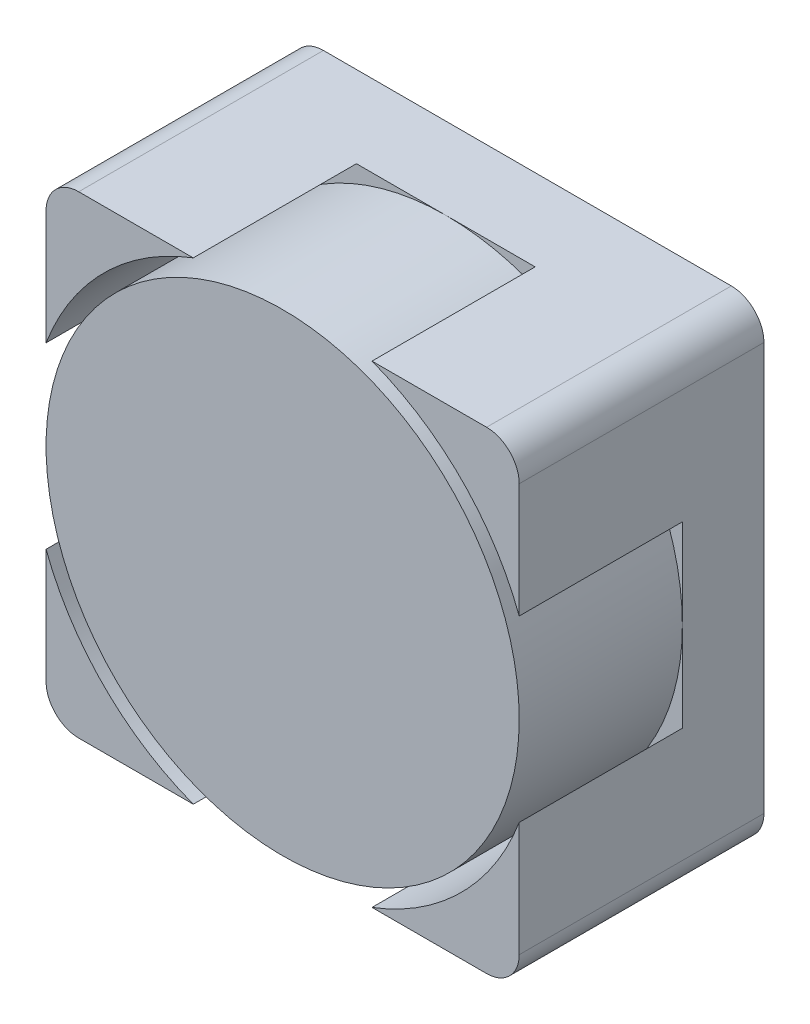
ISO-10303-21;
HEADER;
FILE_DESCRIPTION(('STEP AP214'),'2;1');
FILE_NAME('part.step','',(''),(''),'','','');
FILE_SCHEMA(('AUTOMOTIVE_DESIGN { 1 0 10303 214 1 1 1 1 }'));
ENDSEC;
DATA;
#1=APPLICATION_CONTEXT('core data for automotive mechanical design processes');
#2=APPLICATION_PROTOCOL_DEFINITION('international standard','automotive_design',2000,#1);
#3=PRODUCT_CONTEXT('',#1,'mechanical');
#4=PRODUCT('Part','Part','',(#3));
#5=PRODUCT_RELATED_PRODUCT_CATEGORY('part','',(#4));
#6=PRODUCT_DEFINITION_FORMATION('','',#4);
#7=PRODUCT_DEFINITION_CONTEXT('part definition',#1,'design');
#8=PRODUCT_DEFINITION('design','',#6,#7);
#9=PRODUCT_DEFINITION_SHAPE('','',#8);
#10=(LENGTH_UNIT() NAMED_UNIT(*) SI_UNIT(.MILLI.,.METRE.));
#11=(NAMED_UNIT(*) PLANE_ANGLE_UNIT() SI_UNIT($,.RADIAN.));
#12=(NAMED_UNIT(*) SI_UNIT($,.STERADIAN.) SOLID_ANGLE_UNIT());
#13=UNCERTAINTY_MEASURE_WITH_UNIT(LENGTH_MEASURE(1.E-05),#10,'distance_accuracy_value','');
#14=(GEOMETRIC_REPRESENTATION_CONTEXT(3) GLOBAL_UNCERTAINTY_ASSIGNED_CONTEXT((#13)) GLOBAL_UNIT_ASSIGNED_CONTEXT((#10,
#11,#12)) REPRESENTATION_CONTEXT('',''));
#15=CARTESIAN_POINT('',(0.,0.,0.));
#16=DIRECTION('',(0.,0.,1.));
#17=DIRECTION('',(1.,0.,0.));
#18=AXIS2_PLACEMENT_3D('',#15,#16,#17);
#19=CARTESIAN_POINT('',(0.,0.,3.));
#20=DIRECTION('',(0.,0.,1.));
#21=DIRECTION('',(1.,0.,0.));
#22=AXIS2_PLACEMENT_3D('',#19,#20,#21);
#23=PLANE('',#22);
#24=CARTESIAN_POINT('',(0.,0.,3.));
#25=DIRECTION('',(0.,0.,1.));
#26=DIRECTION('',(1.,0.,0.));
#27=AXIS2_PLACEMENT_3D('',#24,#25,#26);
#28=CIRCLE('',#27,2.9);
#29=CARTESIAN_POINT('',(2.9,0.,3.));
#30=VERTEX_POINT('',#29);
#31=EDGE_CURVE('E20',#30,#30,#28,.F.);
#32=ORIENTED_EDGE('',*,*,#31,.F.);
#33=EDGE_LOOP('',(#32));
#34=FACE_BOUND('',#33,.T.);
#35=ADVANCED_FACE('F17',(#34),#23,.T.);
#36=CARTESIAN_POINT('',(0.,0.,-8.76812408671319));
#37=DIRECTION('',(0.,0.,1.));
#38=DIRECTION('',(1.,0.,0.));
#39=AXIS2_PLACEMENT_3D('',#36,#37,#38);
#40=CYLINDRICAL_SURFACE('',#39,2.9);
#41=ORIENTED_EDGE('',*,*,#31,.T.);
#42=EDGE_LOOP('',(#41));
#43=FACE_BOUND('',#42,.T.);
#44=CARTESIAN_POINT('',(0.,0.,0.999999999999999));
#45=DIRECTION('',(0.,0.,1.));
#46=DIRECTION('',(1.,0.,0.));
#47=AXIS2_PLACEMENT_3D('',#44,#45,#46);
#48=CIRCLE('',#47,2.9);
#49=CARTESIAN_POINT('',(-2.9,0.,1.));
#50=VERTEX_POINT('',#49);
#51=CARTESIAN_POINT('',(0.,2.9,1.));
#52=VERTEX_POINT('',#51);
#53=EDGE_CURVE('E141',#50,#52,#48,.F.);
#54=ORIENTED_EDGE('',*,*,#53,.F.);
#55=CARTESIAN_POINT('',(0.,0.,0.999999999999999));
#56=DIRECTION('',(0.,0.,1.));
#57=DIRECTION('',(1.,0.,0.));
#58=AXIS2_PLACEMENT_3D('',#55,#56,#57);
#59=CIRCLE('',#58,2.9);
#60=CARTESIAN_POINT('',(0.,-2.9,1.));
#61=VERTEX_POINT('',#60);
#62=EDGE_CURVE('E137',#61,#50,#59,.F.);
#63=ORIENTED_EDGE('',*,*,#62,.F.);
#64=CARTESIAN_POINT('',(0.,0.,0.999999999999999));
#65=DIRECTION('',(0.,0.,1.));
#66=DIRECTION('',(1.,0.,0.));
#67=AXIS2_PLACEMENT_3D('',#64,#65,#66);
#68=CIRCLE('',#67,2.9);
#69=CARTESIAN_POINT('',(2.9,0.,1.));
#70=VERTEX_POINT('',#69);
#71=EDGE_CURVE('E128',#70,#61,#68,.F.);
#72=ORIENTED_EDGE('',*,*,#71,.F.);
#73=CARTESIAN_POINT('',(0.,0.,0.999999999999999));
#74=DIRECTION('',(0.,0.,1.));
#75=DIRECTION('',(1.,0.,0.));
#76=AXIS2_PLACEMENT_3D('',#73,#74,#75);
#77=CIRCLE('',#76,2.9);
#78=EDGE_CURVE('E224',#52,#70,#77,.F.);
#79=ORIENTED_EDGE('',*,*,#78,.F.);
#80=EDGE_LOOP('',(#54,#63,#72,#79));
#81=FACE_BOUND('',#80,.T.);
#82=ADVANCED_FACE('F139',(#43,#81),#40,.T.);
#83=CARTESIAN_POINT('',(0.,0.,3.));
#84=DIRECTION('',(0.,0.,1.));
#85=DIRECTION('',(1.,0.,0.));
#86=AXIS2_PLACEMENT_3D('',#83,#84,#85);
#87=PLANE('',#86);
#88=CARTESIAN_POINT('',(0.,0.,3.));
#89=DIRECTION('',(0.,0.,1.));
#90=DIRECTION('',(1.,0.,0.));
#91=AXIS2_PLACEMENT_3D('',#88,#89,#90);
#92=CIRCLE('',#91,3.1);
#93=CARTESIAN_POINT('',(2.9,-1.09544511501034,3.));
#94=VERTEX_POINT('',#93);
#95=CARTESIAN_POINT('',(1.09544511501033,-2.9,3.));
#96=VERTEX_POINT('',#95);
#97=EDGE_CURVE('E208',#94,#96,#92,.F.);
#98=ORIENTED_EDGE('',*,*,#97,.T.);
#99=DIRECTION('',(1.,0.,0.));
#100=VECTOR('',#99,1.);
#101=CARTESIAN_POINT('',(0.,-2.9,3.));
#102=LINE('',#101,#100);
#103=CARTESIAN_POINT('',(2.5,-2.9,3.));
#104=VERTEX_POINT('',#103);
#105=EDGE_CURVE('E168',#96,#104,#102,.T.);
#106=ORIENTED_EDGE('',*,*,#105,.T.);
#107=CARTESIAN_POINT('',(2.5,-2.5,3.));
#108=DIRECTION('',(0.,0.,-1.));
#109=DIRECTION('',(-1.,0.,0.));
#110=AXIS2_PLACEMENT_3D('',#107,#108,#109);
#111=CIRCLE('',#110,0.4);
#112=CARTESIAN_POINT('',(2.9,-2.5,3.));
#113=VERTEX_POINT('',#112);
#114=EDGE_CURVE('E211',#113,#104,#111,.T.);
#115=ORIENTED_EDGE('',*,*,#114,.F.);
#116=DIRECTION('',(0.,1.,0.));
#117=VECTOR('',#116,1.);
#118=CARTESIAN_POINT('',(2.9,0.,3.));
#119=LINE('',#118,#117);
#120=EDGE_CURVE('E178',#113,#94,#119,.T.);
#121=ORIENTED_EDGE('',*,*,#120,.T.);
#122=EDGE_LOOP('',(#98,#106,#115,#121));
#123=FACE_BOUND('',#122,.T.);
#124=ADVANCED_FACE('F339',(#123),#87,.T.);
#125=CARTESIAN_POINT('',(0.,0.,1.));
#126=DIRECTION('',(0.,0.,1.));
#127=DIRECTION('',(1.,0.,0.));
#128=AXIS2_PLACEMENT_3D('',#125,#126,#127);
#129=PLANE('',#128);
#130=DIRECTION('',(1.,0.,0.));
#131=VECTOR('',#130,1.);
#132=CARTESIAN_POINT('',(0.,-2.9,1.));
#133=LINE('',#132,#131);
#134=CARTESIAN_POINT('',(1.09544511501033,-2.9,1.));
#135=VERTEX_POINT('',#134);
#136=EDGE_CURVE('E132',#61,#135,#133,.T.);
#137=ORIENTED_EDGE('',*,*,#136,.T.);
#138=CARTESIAN_POINT('',(0.,0.,0.999999999999999));
#139=DIRECTION('',(0.,0.,1.));
#140=DIRECTION('',(1.,0.,0.));
#141=AXIS2_PLACEMENT_3D('',#138,#139,#140);
#142=CIRCLE('',#141,3.1);
#143=CARTESIAN_POINT('',(2.9,-1.09544511501033,1.));
#144=VERTEX_POINT('',#143);
#145=EDGE_CURVE('E206',#135,#144,#142,.T.);
#146=ORIENTED_EDGE('',*,*,#145,.T.);
#147=DIRECTION('',(0.,1.,0.));
#148=VECTOR('',#147,1.);
#149=CARTESIAN_POINT('',(2.9,0.,1.));
#150=LINE('',#149,#148);
#151=EDGE_CURVE('E125',#144,#70,#150,.T.);
#152=ORIENTED_EDGE('',*,*,#151,.T.);
#153=ORIENTED_EDGE('',*,*,#71,.T.);
#154=EDGE_LOOP('',(#137,#146,#152,#153));
#155=FACE_BOUND('',#154,.T.);
#156=ADVANCED_FACE('F130',(#155),#129,.T.);
#157=CARTESIAN_POINT('',(0.,0.,3.));
#158=DIRECTION('',(0.,0.,1.));
#159=DIRECTION('',(1.,0.,0.));
#160=AXIS2_PLACEMENT_3D('',#157,#158,#159);
#161=PLANE('',#160);
#162=CARTESIAN_POINT('',(0.,0.,3.));
#163=DIRECTION('',(0.,0.,1.));
#164=DIRECTION('',(1.,0.,0.));
#165=AXIS2_PLACEMENT_3D('',#162,#163,#164);
#166=CIRCLE('',#165,3.1);
#167=CARTESIAN_POINT('',(1.09544511501033,2.9,3.));
#168=VERTEX_POINT('',#167);
#169=CARTESIAN_POINT('',(2.9,1.09544511501033,3.));
#170=VERTEX_POINT('',#169);
#171=EDGE_CURVE('E198',#168,#170,#166,.F.);
#172=ORIENTED_EDGE('',*,*,#171,.T.);
#173=DIRECTION('',(0.,1.,0.));
#174=VECTOR('',#173,1.);
#175=CARTESIAN_POINT('',(2.9,0.,3.));
#176=LINE('',#175,#174);
#177=CARTESIAN_POINT('',(2.9,2.5,3.));
#178=VERTEX_POINT('',#177);
#179=EDGE_CURVE('E163',#170,#178,#176,.T.);
#180=ORIENTED_EDGE('',*,*,#179,.T.);
#181=CARTESIAN_POINT('',(2.5,2.5,3.));
#182=DIRECTION('',(0.,0.,-1.));
#183=DIRECTION('',(-1.,0.,0.));
#184=AXIS2_PLACEMENT_3D('',#181,#182,#183);
#185=CIRCLE('',#184,0.4);
#186=CARTESIAN_POINT('',(2.5,2.9,3.));
#187=VERTEX_POINT('',#186);
#188=EDGE_CURVE('E201',#187,#178,#185,.T.);
#189=ORIENTED_EDGE('',*,*,#188,.F.);
#190=DIRECTION('',(1.,0.,0.));
#191=VECTOR('',#190,1.);
#192=CARTESIAN_POINT('',(0.,2.9,3.));
#193=LINE('',#192,#191);
#194=EDGE_CURVE('E161',#187,#168,#193,.F.);
#195=ORIENTED_EDGE('',*,*,#194,.T.);
#196=EDGE_LOOP('',(#172,#180,#189,#195));
#197=FACE_BOUND('',#196,.T.);
#198=ADVANCED_FACE('F326',(#197),#161,.T.);
#199=CARTESIAN_POINT('',(0.,0.,1.));
#200=DIRECTION('',(0.,0.,1.));
#201=DIRECTION('',(1.,0.,0.));
#202=AXIS2_PLACEMENT_3D('',#199,#200,#201);
#203=PLANE('',#202);
#204=DIRECTION('',(0.,1.,0.));
#205=VECTOR('',#204,1.);
#206=CARTESIAN_POINT('',(2.9,0.,1.));
#207=LINE('',#206,#205);
#208=CARTESIAN_POINT('',(2.9,1.09544511501033,1.));
#209=VERTEX_POINT('',#208);
#210=EDGE_CURVE('E223',#70,#209,#207,.T.);
#211=ORIENTED_EDGE('',*,*,#210,.T.);
#212=CARTESIAN_POINT('',(0.,0.,0.999999999999999));
#213=DIRECTION('',(0.,0.,1.));
#214=DIRECTION('',(1.,0.,0.));
#215=AXIS2_PLACEMENT_3D('',#212,#213,#214);
#216=CIRCLE('',#215,3.1);
#217=CARTESIAN_POINT('',(1.09544511501033,2.9,1.));
#218=VERTEX_POINT('',#217);
#219=EDGE_CURVE('E195',#209,#218,#216,.T.);
#220=ORIENTED_EDGE('',*,*,#219,.T.);
#221=DIRECTION('',(1.,0.,0.));
#222=VECTOR('',#221,1.);
#223=CARTESIAN_POINT('',(0.,2.9,1.));
#224=LINE('',#223,#222);
#225=EDGE_CURVE('E226',#218,#52,#224,.F.);
#226=ORIENTED_EDGE('',*,*,#225,.T.);
#227=ORIENTED_EDGE('',*,*,#78,.T.);
#228=EDGE_LOOP('',(#211,#220,#226,#227));
#229=FACE_BOUND('',#228,.T.);
#230=ADVANCED_FACE('F342',(#229),#203,.T.);
#231=CARTESIAN_POINT('',(0.,0.,3.));
#232=DIRECTION('',(0.,0.,1.));
#233=DIRECTION('',(1.,0.,0.));
#234=AXIS2_PLACEMENT_3D('',#231,#232,#233);
#235=PLANE('',#234);
#236=CARTESIAN_POINT('',(0.,0.,3.));
#237=DIRECTION('',(0.,0.,1.));
#238=DIRECTION('',(1.,0.,0.));
#239=AXIS2_PLACEMENT_3D('',#236,#237,#238);
#240=CIRCLE('',#239,3.1);
#241=CARTESIAN_POINT('',(-1.09544511501033,-2.9,3.));
#242=VERTEX_POINT('',#241);
#243=CARTESIAN_POINT('',(-2.9,-1.09544511501033,3.));
#244=VERTEX_POINT('',#243);
#245=EDGE_CURVE('E192',#242,#244,#240,.F.);
#246=ORIENTED_EDGE('',*,*,#245,.T.);
#247=DIRECTION('',(0.,1.,0.));
#248=VECTOR('',#247,1.);
#249=CARTESIAN_POINT('',(-2.9,0.,3.));
#250=LINE('',#249,#248);
#251=CARTESIAN_POINT('',(-2.9,-2.5,3.));
#252=VERTEX_POINT('',#251);
#253=EDGE_CURVE('E154',#244,#252,#250,.F.);
#254=ORIENTED_EDGE('',*,*,#253,.T.);
#255=CARTESIAN_POINT('',(-2.5,-2.5,3.));
#256=DIRECTION('',(0.,0.,-1.));
#257=DIRECTION('',(-1.,0.,0.));
#258=AXIS2_PLACEMENT_3D('',#255,#256,#257);
#259=CIRCLE('',#258,0.4);
#260=CARTESIAN_POINT('',(-2.5,-2.9,3.));
#261=VERTEX_POINT('',#260);
#262=EDGE_CURVE('E220',#252,#261,#259,.F.);
#263=ORIENTED_EDGE('',*,*,#262,.T.);
#264=DIRECTION('',(1.,0.,0.));
#265=VECTOR('',#264,1.);
#266=CARTESIAN_POINT('',(0.,-2.9,3.));
#267=LINE('',#266,#265);
#268=EDGE_CURVE('E222',#261,#242,#267,.T.);
#269=ORIENTED_EDGE('',*,*,#268,.T.);
#270=EDGE_LOOP('',(#246,#254,#263,#269));
#271=FACE_BOUND('',#270,.T.);
#272=ADVANCED_FACE('F287',(#271),#235,.T.);
#273=CARTESIAN_POINT('',(0.,0.,1.));
#274=DIRECTION('',(0.,0.,1.));
#275=DIRECTION('',(1.,0.,0.));
#276=AXIS2_PLACEMENT_3D('',#273,#274,#275);
#277=PLANE('',#276);
#278=DIRECTION('',(0.,1.,0.));
#279=VECTOR('',#278,1.);
#280=CARTESIAN_POINT('',(-2.9,0.,1.));
#281=LINE('',#280,#279);
#282=CARTESIAN_POINT('',(-2.9,-1.09544511501033,1.));
#283=VERTEX_POINT('',#282);
#284=EDGE_CURVE('E144',#50,#283,#281,.F.);
#285=ORIENTED_EDGE('',*,*,#284,.T.);
#286=CARTESIAN_POINT('',(0.,0.,0.999999999999999));
#287=DIRECTION('',(0.,0.,1.));
#288=DIRECTION('',(1.,0.,0.));
#289=AXIS2_PLACEMENT_3D('',#286,#287,#288);
#290=CIRCLE('',#289,3.1);
#291=CARTESIAN_POINT('',(-1.09544511501033,-2.9,1.));
#292=VERTEX_POINT('',#291);
#293=EDGE_CURVE('E150',#283,#292,#290,.T.);
#294=ORIENTED_EDGE('',*,*,#293,.T.);
#295=DIRECTION('',(1.,0.,0.));
#296=VECTOR('',#295,1.);
#297=CARTESIAN_POINT('',(0.,-2.9,1.));
#298=LINE('',#297,#296);
#299=EDGE_CURVE('E145',#292,#61,#298,.T.);
#300=ORIENTED_EDGE('',*,*,#299,.T.);
#301=ORIENTED_EDGE('',*,*,#62,.T.);
#302=EDGE_LOOP('',(#285,#294,#300,#301));
#303=FACE_BOUND('',#302,.T.);
#304=ADVANCED_FACE('F148',(#303),#277,.T.);
#305=CARTESIAN_POINT('',(0.,0.,1.));
#306=DIRECTION('',(0.,0.,1.));
#307=DIRECTION('',(1.,0.,0.));
#308=AXIS2_PLACEMENT_3D('',#305,#306,#307);
#309=PLANE('',#308);
#310=DIRECTION('',(0.,1.,0.));
#311=VECTOR('',#310,1.);
#312=CARTESIAN_POINT('',(-2.9,0.,1.));
#313=LINE('',#312,#311);
#314=CARTESIAN_POINT('',(-2.9,1.09544511501033,1.));
#315=VERTEX_POINT('',#314);
#316=EDGE_CURVE('E218',#315,#50,#313,.F.);
#317=ORIENTED_EDGE('',*,*,#316,.T.);
#318=ORIENTED_EDGE('',*,*,#53,.T.);
#319=DIRECTION('',(1.,0.,0.));
#320=VECTOR('',#319,1.);
#321=CARTESIAN_POINT('',(0.,2.9,1.));
#322=LINE('',#321,#320);
#323=CARTESIAN_POINT('',(-1.09544511501033,2.9,1.));
#324=VERTEX_POINT('',#323);
#325=EDGE_CURVE('E280',#52,#324,#322,.F.);
#326=ORIENTED_EDGE('',*,*,#325,.T.);
#327=CARTESIAN_POINT('',(0.,0.,0.999999999999999));
#328=DIRECTION('',(0.,0.,1.));
#329=DIRECTION('',(1.,0.,0.));
#330=AXIS2_PLACEMENT_3D('',#327,#328,#329);
#331=CIRCLE('',#330,3.1);
#332=EDGE_CURVE('E182',#324,#315,#331,.T.);
#333=ORIENTED_EDGE('',*,*,#332,.T.);
#334=EDGE_LOOP('',(#317,#318,#326,#333));
#335=FACE_BOUND('',#334,.T.);
#336=ADVANCED_FACE('F462',(#335),#309,.T.);
#337=CARTESIAN_POINT('',(0.,0.,3.));
#338=DIRECTION('',(0.,0.,1.));
#339=DIRECTION('',(1.,0.,0.));
#340=AXIS2_PLACEMENT_3D('',#337,#338,#339);
#341=PLANE('',#340);
#342=CARTESIAN_POINT('',(0.,0.,3.));
#343=DIRECTION('',(0.,0.,1.));
#344=DIRECTION('',(1.,0.,0.));
#345=AXIS2_PLACEMENT_3D('',#342,#343,#344);
#346=CIRCLE('',#345,3.1);
#347=CARTESIAN_POINT('',(-2.9,1.09544511501033,3.));
#348=VERTEX_POINT('',#347);
#349=CARTESIAN_POINT('',(-1.09544511501033,2.9,3.));
#350=VERTEX_POINT('',#349);
#351=EDGE_CURVE('E171',#348,#350,#346,.F.);
#352=ORIENTED_EDGE('',*,*,#351,.T.);
#353=DIRECTION('',(1.,0.,0.));
#354=VECTOR('',#353,1.);
#355=CARTESIAN_POINT('',(0.,2.9,3.));
#356=LINE('',#355,#354);
#357=CARTESIAN_POINT('',(-2.5,2.9,3.));
#358=VERTEX_POINT('',#357);
#359=EDGE_CURVE('E216',#350,#358,#356,.F.);
#360=ORIENTED_EDGE('',*,*,#359,.T.);
#361=CARTESIAN_POINT('',(-2.5,2.5,3.));
#362=DIRECTION('',(0.,0.,-1.));
#363=DIRECTION('',(-1.,0.,0.));
#364=AXIS2_PLACEMENT_3D('',#361,#362,#363);
#365=CIRCLE('',#364,0.4);
#366=CARTESIAN_POINT('',(-2.9,2.5,3.));
#367=VERTEX_POINT('',#366);
#368=EDGE_CURVE('E185',#367,#358,#365,.T.);
#369=ORIENTED_EDGE('',*,*,#368,.F.);
#370=DIRECTION('',(0.,1.,0.));
#371=VECTOR('',#370,1.);
#372=CARTESIAN_POINT('',(-2.9,0.,3.));
#373=LINE('',#372,#371);
#374=EDGE_CURVE('E217',#367,#348,#373,.F.);
#375=ORIENTED_EDGE('',*,*,#374,.T.);
#376=EDGE_LOOP('',(#352,#360,#369,#375));
#377=FACE_BOUND('',#376,.T.);
#378=ADVANCED_FACE('F454',(#377),#341,.T.);
#379=CARTESIAN_POINT('',(2.5,-2.5,3.));
#380=DIRECTION('',(0.,0.,-1.));
#381=DIRECTION('',(-1.,0.,0.));
#382=AXIS2_PLACEMENT_3D('',#379,#380,#381);
#383=CYLINDRICAL_SURFACE('',#382,0.4);
#384=ORIENTED_EDGE('',*,*,#114,.T.);
#385=DIRECTION('',(0.,0.,1.));
#386=VECTOR('',#385,1.);
#387=CARTESIAN_POINT('',(2.5,-2.9,3.));
#388=LINE('',#387,#386);
#389=CARTESIAN_POINT('',(2.5,-2.9,0.));
#390=VERTEX_POINT('',#389);
#391=EDGE_CURVE('E170',#104,#390,#388,.F.);
#392=ORIENTED_EDGE('',*,*,#391,.T.);
#393=CARTESIAN_POINT('',(2.5,-2.5,0.));
#394=DIRECTION('',(0.,0.,-1.));
#395=DIRECTION('',(-1.,0.,0.));
#396=AXIS2_PLACEMENT_3D('',#393,#394,#395);
#397=CIRCLE('',#396,0.4);
#398=CARTESIAN_POINT('',(2.9,-2.5,0.));
#399=VERTEX_POINT('',#398);
#400=EDGE_CURVE('E214',#390,#399,#397,.F.);
#401=ORIENTED_EDGE('',*,*,#400,.T.);
#402=DIRECTION('',(0.,0.,1.));
#403=VECTOR('',#402,1.);
#404=CARTESIAN_POINT('',(2.9,-2.5,3.));
#405=LINE('',#404,#403);
#406=EDGE_CURVE('E176',#399,#113,#405,.T.);
#407=ORIENTED_EDGE('',*,*,#406,.T.);
#408=EDGE_LOOP('',(#384,#392,#401,#407));
#409=FACE_BOUND('',#408,.T.);
#410=ADVANCED_FACE('F336',(#409),#383,.T.);
#411=CARTESIAN_POINT('',(0.,0.,-8.76812408671319));
#412=DIRECTION('',(0.,0.,1.));
#413=DIRECTION('',(1.,0.,0.));
#414=AXIS2_PLACEMENT_3D('',#411,#412,#413);
#415=CYLINDRICAL_SURFACE('',#414,3.1);
#416=ORIENTED_EDGE('',*,*,#145,.F.);
#417=DIRECTION('',(0.,0.,1.));
#418=VECTOR('',#417,1.);
#419=CARTESIAN_POINT('',(1.09544511501033,-2.9,3.));
#420=LINE('',#419,#418);
#421=EDGE_CURVE('E160',#135,#96,#420,.T.);
#422=ORIENTED_EDGE('',*,*,#421,.T.);
#423=ORIENTED_EDGE('',*,*,#97,.F.);
#424=DIRECTION('',(0.,0.,1.));
#425=VECTOR('',#424,1.);
#426=CARTESIAN_POINT('',(2.9,-1.09544511501033,3.));
#427=LINE('',#426,#425);
#428=EDGE_CURVE('E172',#94,#144,#427,.F.);
#429=ORIENTED_EDGE('',*,*,#428,.T.);
#430=EDGE_LOOP('',(#416,#422,#423,#429));
#431=FACE_BOUND('',#430,.T.);
#432=ADVANCED_FACE('F341',(#431),#415,.F.);
#433=CARTESIAN_POINT('',(2.5,2.5,3.));
#434=DIRECTION('',(0.,0.,-1.));
#435=DIRECTION('',(-1.,0.,0.));
#436=AXIS2_PLACEMENT_3D('',#433,#434,#435);
#437=CYLINDRICAL_SURFACE('',#436,0.4);
#438=ORIENTED_EDGE('',*,*,#188,.T.);
#439=DIRECTION('',(0.,0.,1.));
#440=VECTOR('',#439,1.);
#441=CARTESIAN_POINT('',(2.9,2.5,3.));
#442=LINE('',#441,#440);
#443=CARTESIAN_POINT('',(2.9,2.5,0.));
#444=VERTEX_POINT('',#443);
#445=EDGE_CURVE('E236',#178,#444,#442,.F.);
#446=ORIENTED_EDGE('',*,*,#445,.T.);
#447=CARTESIAN_POINT('',(2.5,2.5,0.));
#448=DIRECTION('',(0.,0.,-1.));
#449=DIRECTION('',(-1.,0.,0.));
#450=AXIS2_PLACEMENT_3D('',#447,#448,#449);
#451=CIRCLE('',#450,0.4);
#452=CARTESIAN_POINT('',(2.5,2.9,0.));
#453=VERTEX_POINT('',#452);
#454=EDGE_CURVE('E204',#444,#453,#451,.F.);
#455=ORIENTED_EDGE('',*,*,#454,.T.);
#456=DIRECTION('',(0.,0.,-1.));
#457=VECTOR('',#456,1.);
#458=CARTESIAN_POINT('',(2.5,2.9,3.));
#459=LINE('',#458,#457);
#460=EDGE_CURVE('E241',#453,#187,#459,.F.);
#461=ORIENTED_EDGE('',*,*,#460,.T.);
#462=EDGE_LOOP('',(#438,#446,#455,#461));
#463=FACE_BOUND('',#462,.T.);
#464=ADVANCED_FACE('F328',(#463),#437,.T.);
#465=CARTESIAN_POINT('',(0.,0.,-8.76812408671319));
#466=DIRECTION('',(0.,0.,1.));
#467=DIRECTION('',(1.,0.,0.));
#468=AXIS2_PLACEMENT_3D('',#465,#466,#467);
#469=CYLINDRICAL_SURFACE('',#468,3.1);
#470=ORIENTED_EDGE('',*,*,#219,.F.);
#471=DIRECTION('',(0.,0.,1.));
#472=VECTOR('',#471,1.);
#473=CARTESIAN_POINT('',(2.9,1.09544511501033,3.));
#474=LINE('',#473,#472);
#475=EDGE_CURVE('E233',#209,#170,#474,.T.);
#476=ORIENTED_EDGE('',*,*,#475,.T.);
#477=ORIENTED_EDGE('',*,*,#171,.F.);
#478=DIRECTION('',(0.,0.,-1.));
#479=VECTOR('',#478,1.);
#480=CARTESIAN_POINT('',(1.09544511501033,2.9,3.));
#481=LINE('',#480,#479);
#482=EDGE_CURVE('E238',#168,#218,#481,.T.);
#483=ORIENTED_EDGE('',*,*,#482,.T.);
#484=EDGE_LOOP('',(#470,#476,#477,#483));
#485=FACE_BOUND('',#484,.T.);
#486=ADVANCED_FACE('F343',(#485),#469,.F.);
#487=CARTESIAN_POINT('',(0.,0.,-8.76812408671319));
#488=DIRECTION('',(0.,0.,1.));
#489=DIRECTION('',(1.,0.,0.));
#490=AXIS2_PLACEMENT_3D('',#487,#488,#489);
#491=CYLINDRICAL_SURFACE('',#490,3.1);
#492=ORIENTED_EDGE('',*,*,#293,.F.);
#493=DIRECTION('',(0.,0.,1.));
#494=VECTOR('',#493,1.);
#495=CARTESIAN_POINT('',(-2.9,-1.09544511501033,3.));
#496=LINE('',#495,#494);
#497=EDGE_CURVE('E240',#283,#244,#496,.T.);
#498=ORIENTED_EDGE('',*,*,#497,.T.);
#499=ORIENTED_EDGE('',*,*,#245,.F.);
#500=DIRECTION('',(0.,0.,1.));
#501=VECTOR('',#500,1.);
#502=CARTESIAN_POINT('',(-1.09544511501033,-2.9,3.));
#503=LINE('',#502,#501);
#504=EDGE_CURVE('E237',#242,#292,#503,.F.);
#505=ORIENTED_EDGE('',*,*,#504,.T.);
#506=EDGE_LOOP('',(#492,#498,#499,#505));
#507=FACE_BOUND('',#506,.T.);
#508=ADVANCED_FACE('F291',(#507),#491,.F.);
#509=CARTESIAN_POINT('',(-2.5,-2.5,3.));
#510=DIRECTION('',(0.,0.,-1.));
#511=DIRECTION('',(-1.,0.,0.));
#512=AXIS2_PLACEMENT_3D('',#509,#510,#511);
#513=CYLINDRICAL_SURFACE('',#512,0.4);
#514=ORIENTED_EDGE('',*,*,#262,.F.);
#515=DIRECTION('',(0.,0.,1.));
#516=VECTOR('',#515,1.);
#517=CARTESIAN_POINT('',(-2.9,-2.5,3.));
#518=LINE('',#517,#516);
#519=CARTESIAN_POINT('',(-2.9,-2.5,0.));
#520=VERTEX_POINT('',#519);
#521=EDGE_CURVE('E247',#252,#520,#518,.F.);
#522=ORIENTED_EDGE('',*,*,#521,.T.);
#523=CARTESIAN_POINT('',(-2.5,-2.5,0.));
#524=DIRECTION('',(0.,0.,-1.));
#525=DIRECTION('',(-1.,0.,0.));
#526=AXIS2_PLACEMENT_3D('',#523,#524,#525);
#527=CIRCLE('',#526,0.4);
#528=CARTESIAN_POINT('',(-2.5,-2.9,0.));
#529=VERTEX_POINT('',#528);
#530=EDGE_CURVE('E35',#520,#529,#527,.F.);
#531=ORIENTED_EDGE('',*,*,#530,.T.);
#532=DIRECTION('',(0.,0.,1.));
#533=VECTOR('',#532,1.);
#534=CARTESIAN_POINT('',(-2.5,-2.9,3.));
#535=LINE('',#534,#533);
#536=EDGE_CURVE('E263',#529,#261,#535,.T.);
#537=ORIENTED_EDGE('',*,*,#536,.T.);
#538=EDGE_LOOP('',(#514,#522,#531,#537));
#539=FACE_BOUND('',#538,.T.);
#540=ADVANCED_FACE('F301',(#539),#513,.T.);
#541=CARTESIAN_POINT('',(-2.5,2.5,3.));
#542=DIRECTION('',(0.,0.,-1.));
#543=DIRECTION('',(-1.,0.,0.));
#544=AXIS2_PLACEMENT_3D('',#541,#542,#543);
#545=CYLINDRICAL_SURFACE('',#544,0.4);
#546=ORIENTED_EDGE('',*,*,#368,.T.);
#547=DIRECTION('',(0.,0.,-1.));
#548=VECTOR('',#547,1.);
#549=CARTESIAN_POINT('',(-2.5,2.9,3.));
#550=LINE('',#549,#548);
#551=CARTESIAN_POINT('',(-2.5,2.9,0.));
#552=VERTEX_POINT('',#551);
#553=EDGE_CURVE('E250',#358,#552,#550,.T.);
#554=ORIENTED_EDGE('',*,*,#553,.T.);
#555=CARTESIAN_POINT('',(-2.5,2.5,0.));
#556=DIRECTION('',(0.,0.,-1.));
#557=DIRECTION('',(-1.,0.,0.));
#558=AXIS2_PLACEMENT_3D('',#555,#556,#557);
#559=CIRCLE('',#558,0.4);
#560=CARTESIAN_POINT('',(-2.9,2.5,0.));
#561=VERTEX_POINT('',#560);
#562=EDGE_CURVE('E188',#552,#561,#559,.F.);
#563=ORIENTED_EDGE('',*,*,#562,.T.);
#564=DIRECTION('',(0.,0.,1.));
#565=VECTOR('',#564,1.);
#566=CARTESIAN_POINT('',(-2.9,2.5,3.));
#567=LINE('',#566,#565);
#568=EDGE_CURVE('E276',#561,#367,#567,.T.);
#569=ORIENTED_EDGE('',*,*,#568,.T.);
#570=EDGE_LOOP('',(#546,#554,#563,#569));
#571=FACE_BOUND('',#570,.T.);
#572=ADVANCED_FACE('F313',(#571),#545,.T.);
#573=CARTESIAN_POINT('',(0.,0.,-8.76812408671319));
#574=DIRECTION('',(0.,0.,1.));
#575=DIRECTION('',(1.,0.,0.));
#576=AXIS2_PLACEMENT_3D('',#573,#574,#575);
#577=CYLINDRICAL_SURFACE('',#576,3.1);
#578=ORIENTED_EDGE('',*,*,#351,.F.);
#579=DIRECTION('',(0.,0.,1.));
#580=VECTOR('',#579,1.);
#581=CARTESIAN_POINT('',(-2.9,1.09544511501033,3.));
#582=LINE('',#581,#580);
#583=EDGE_CURVE('E272',#348,#315,#582,.F.);
#584=ORIENTED_EDGE('',*,*,#583,.T.);
#585=ORIENTED_EDGE('',*,*,#332,.F.);
#586=DIRECTION('',(0.,0.,-1.));
#587=VECTOR('',#586,1.);
#588=CARTESIAN_POINT('',(-1.09544511501033,2.9,3.));
#589=LINE('',#588,#587);
#590=EDGE_CURVE('E175',#324,#350,#589,.F.);
#591=ORIENTED_EDGE('',*,*,#590,.T.);
#592=EDGE_LOOP('',(#578,#584,#585,#591));
#593=FACE_BOUND('',#592,.T.);
#594=ADVANCED_FACE('F366',(#593),#577,.F.);
#595=CARTESIAN_POINT('',(2.9,-2.9,3.));
#596=DIRECTION('',(0.,1.,0.));
#597=DIRECTION('',(0.,0.,1.));
#598=AXIS2_PLACEMENT_3D('',#595,#596,#597);
#599=PLANE('',#598);
#600=ORIENTED_EDGE('',*,*,#268,.F.);
#601=ORIENTED_EDGE('',*,*,#536,.F.);
#602=DIRECTION('',(1.,0.,0.));
#603=VECTOR('',#602,1.);
#604=CARTESIAN_POINT('',(0.,-2.9,0.));
#605=LINE('',#604,#603);
#606=EDGE_CURVE('E275',#529,#390,#605,.T.);
#607=ORIENTED_EDGE('',*,*,#606,.T.);
#608=ORIENTED_EDGE('',*,*,#391,.F.);
#609=ORIENTED_EDGE('',*,*,#105,.F.);
#610=ORIENTED_EDGE('',*,*,#421,.F.);
#611=ORIENTED_EDGE('',*,*,#136,.F.);
#612=ORIENTED_EDGE('',*,*,#299,.F.);
#613=ORIENTED_EDGE('',*,*,#504,.F.);
#614=EDGE_LOOP('',(#600,#601,#607,#608,#609,#610,#611,#612,#613));
#615=FACE_BOUND('',#614,.T.);
#616=ADVANCED_FACE('F158',(#615),#599,.F.);
#617=CARTESIAN_POINT('',(2.9,-2.9,3.));
#618=DIRECTION('',(-1.,0.,0.));
#619=DIRECTION('',(0.,-1.,0.));
#620=AXIS2_PLACEMENT_3D('',#617,#618,#619);
#621=PLANE('',#620);
#622=ORIENTED_EDGE('',*,*,#120,.F.);
#623=ORIENTED_EDGE('',*,*,#406,.F.);
#624=DIRECTION('',(0.,1.,0.));
#625=VECTOR('',#624,1.);
#626=CARTESIAN_POINT('',(2.9,0.,0.));
#627=LINE('',#626,#625);
#628=EDGE_CURVE('E306',#399,#444,#627,.T.);
#629=ORIENTED_EDGE('',*,*,#628,.T.);
#630=ORIENTED_EDGE('',*,*,#445,.F.);
#631=ORIENTED_EDGE('',*,*,#179,.F.);
#632=ORIENTED_EDGE('',*,*,#475,.F.);
#633=ORIENTED_EDGE('',*,*,#210,.F.);
#634=ORIENTED_EDGE('',*,*,#151,.F.);
#635=ORIENTED_EDGE('',*,*,#428,.F.);
#636=EDGE_LOOP('',(#622,#623,#629,#630,#631,#632,#633,#634,#635));
#637=FACE_BOUND('',#636,.T.);
#638=ADVANCED_FACE('F330',(#637),#621,.F.);
#639=CARTESIAN_POINT('',(2.9,2.9,3.));
#640=DIRECTION('',(0.,-1.,0.));
#641=DIRECTION('',(0.,0.,-1.));
#642=AXIS2_PLACEMENT_3D('',#639,#640,#641);
#643=PLANE('',#642);
#644=ORIENTED_EDGE('',*,*,#194,.F.);
#645=ORIENTED_EDGE('',*,*,#460,.F.);
#646=DIRECTION('',(1.,0.,0.));
#647=VECTOR('',#646,1.);
#648=CARTESIAN_POINT('',(0.,2.9,0.));
#649=LINE('',#648,#647);
#650=EDGE_CURVE('E26',#453,#552,#649,.F.);
#651=ORIENTED_EDGE('',*,*,#650,.T.);
#652=ORIENTED_EDGE('',*,*,#553,.F.);
#653=ORIENTED_EDGE('',*,*,#359,.F.);
#654=ORIENTED_EDGE('',*,*,#590,.F.);
#655=ORIENTED_EDGE('',*,*,#325,.F.);
#656=ORIENTED_EDGE('',*,*,#225,.F.);
#657=ORIENTED_EDGE('',*,*,#482,.F.);
#658=EDGE_LOOP('',(#644,#645,#651,#652,#653,#654,#655,#656,#657));
#659=FACE_BOUND('',#658,.T.);
#660=ADVANCED_FACE('F323',(#659),#643,.F.);
#661=CARTESIAN_POINT('',(-2.9,-2.9,3.));
#662=DIRECTION('',(1.,0.,0.));
#663=DIRECTION('',(0.,1.,0.));
#664=AXIS2_PLACEMENT_3D('',#661,#662,#663);
#665=PLANE('',#664);
#666=ORIENTED_EDGE('',*,*,#374,.F.);
#667=ORIENTED_EDGE('',*,*,#568,.F.);
#668=DIRECTION('',(0.,1.,0.));
#669=VECTOR('',#668,1.);
#670=CARTESIAN_POINT('',(-2.9,0.,0.));
#671=LINE('',#670,#669);
#672=EDGE_CURVE('E11',#561,#520,#671,.F.);
#673=ORIENTED_EDGE('',*,*,#672,.T.);
#674=ORIENTED_EDGE('',*,*,#521,.F.);
#675=ORIENTED_EDGE('',*,*,#253,.F.);
#676=ORIENTED_EDGE('',*,*,#497,.F.);
#677=ORIENTED_EDGE('',*,*,#284,.F.);
#678=ORIENTED_EDGE('',*,*,#316,.F.);
#679=ORIENTED_EDGE('',*,*,#583,.F.);
#680=EDGE_LOOP('',(#666,#667,#673,#674,#675,#676,#677,#678,#679));
#681=FACE_BOUND('',#680,.T.);
#682=ADVANCED_FACE('F296',(#681),#665,.F.);
#683=CARTESIAN_POINT('',(0.,0.,0.));
#684=DIRECTION('',(0.,0.,1.));
#685=DIRECTION('',(1.,0.,0.));
#686=AXIS2_PLACEMENT_3D('',#683,#684,#685);
#687=PLANE('',#686);
#688=ORIENTED_EDGE('',*,*,#672,.F.);
#689=ORIENTED_EDGE('',*,*,#562,.F.);
#690=ORIENTED_EDGE('',*,*,#650,.F.);
#691=ORIENTED_EDGE('',*,*,#454,.F.);
#692=ORIENTED_EDGE('',*,*,#628,.F.);
#693=ORIENTED_EDGE('',*,*,#400,.F.);
#694=ORIENTED_EDGE('',*,*,#606,.F.);
#695=ORIENTED_EDGE('',*,*,#530,.F.);
#696=EDGE_LOOP('',(#688,#689,#690,#691,#692,#693,#694,#695));
#697=FACE_BOUND('',#696,.T.);
#698=ADVANCED_FACE('F304',(#697),#687,.F.);
#699=CLOSED_SHELL('',(#35,#82,#124,#156,#198,#230,#272,#304,#336,#378,#410,#432,#464,#486,#508,
#540,#572,#594,#616,#638,#660,#682,#698));
#700=MANIFOLD_SOLID_BREP('B1',#699);
#701=ADVANCED_BREP_SHAPE_REPRESENTATION('',(#18,#700),#14);
#702=SHAPE_DEFINITION_REPRESENTATION(#9,#701);
ENDSEC;
END-ISO-10303-21;
